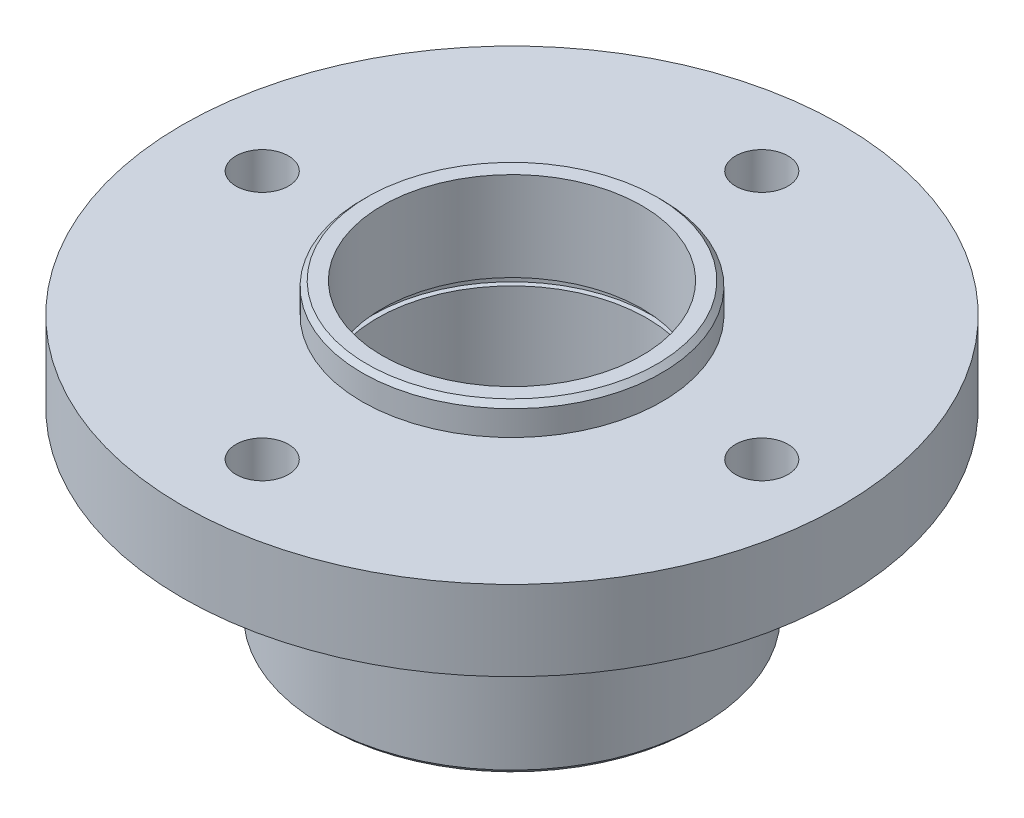
ISO-10303-21;
HEADER;
FILE_DESCRIPTION(('STEP AP214'),'2;1');
FILE_NAME('part.step','',(''),(''),'','','');
FILE_SCHEMA(('AUTOMOTIVE_DESIGN { 1 0 10303 214 1 1 1 1 }'));
ENDSEC;
DATA;
#1=APPLICATION_CONTEXT('core data for automotive mechanical design processes');
#2=APPLICATION_PROTOCOL_DEFINITION('international standard','automotive_design',2000,#1);
#3=PRODUCT_CONTEXT('',#1,'mechanical');
#4=PRODUCT('Part','Part','',(#3));
#5=PRODUCT_RELATED_PRODUCT_CATEGORY('part','',(#4));
#6=PRODUCT_DEFINITION_FORMATION('','',#4);
#7=PRODUCT_DEFINITION_CONTEXT('part definition',#1,'design');
#8=PRODUCT_DEFINITION('design','',#6,#7);
#9=PRODUCT_DEFINITION_SHAPE('','',#8);
#10=(LENGTH_UNIT() NAMED_UNIT(*) SI_UNIT(.MILLI.,.METRE.));
#11=(NAMED_UNIT(*) PLANE_ANGLE_UNIT() SI_UNIT($,.RADIAN.));
#12=(NAMED_UNIT(*) SI_UNIT($,.STERADIAN.) SOLID_ANGLE_UNIT());
#13=UNCERTAINTY_MEASURE_WITH_UNIT(LENGTH_MEASURE(1.E-05),#10,'distance_accuracy_value','');
#14=(GEOMETRIC_REPRESENTATION_CONTEXT(3) GLOBAL_UNCERTAINTY_ASSIGNED_CONTEXT((#13)) GLOBAL_UNIT_ASSIGNED_CONTEXT((#10,
#11,#12)) REPRESENTATION_CONTEXT('',''));
#15=CARTESIAN_POINT('',(0.,0.,0.));
#16=DIRECTION('',(0.,0.,1.));
#17=DIRECTION('',(1.,0.,0.));
#18=AXIS2_PLACEMENT_3D('',#15,#16,#17);
#19=CARTESIAN_POINT('',(26.,86.9231489378866,0.));
#20=DIRECTION('',(0.,1.,0.));
#21=DIRECTION('',(0.,0.,1.));
#22=AXIS2_PLACEMENT_3D('',#19,#20,#21);
#23=PLANE('',#22);
#24=CARTESIAN_POINT('',(0.,86.9231489378866,0.));
#25=DIRECTION('',(0.,-1.,0.));
#26=DIRECTION('',(0.,0.,-1.));
#27=AXIS2_PLACEMENT_3D('',#24,#25,#26);
#28=CIRCLE('',#27,26.);
#29=CARTESIAN_POINT('',(0.,86.9231489378866,-26.));
#30=VERTEX_POINT('',#29);
#31=EDGE_CURVE('E10',#30,#30,#28,.T.);
#32=ORIENTED_EDGE('',*,*,#31,.T.);
#33=EDGE_LOOP('',(#32));
#34=FACE_BOUND('',#33,.T.);
#35=CARTESIAN_POINT('',(0.,86.9231489378866,0.));
#36=DIRECTION('',(0.,-1.,0.));
#37=DIRECTION('',(0.,0.,-1.));
#38=AXIS2_PLACEMENT_3D('',#35,#36,#37);
#39=CIRCLE('',#38,29.);
#40=CARTESIAN_POINT('',(0.,86.9231489378866,-29.));
#41=VERTEX_POINT('',#40);
#42=EDGE_CURVE('E40',#41,#41,#39,.T.);
#43=ORIENTED_EDGE('',*,*,#42,.F.);
#44=EDGE_LOOP('',(#43));
#45=FACE_BOUND('',#44,.T.);
#46=ADVANCED_FACE('F34',(#34,#45),#23,.T.);
#47=CARTESIAN_POINT('',(0.,85.9231489378866,0.));
#48=DIRECTION('',(0.,-1.,0.));
#49=DIRECTION('',(0.,0.,-1.));
#50=AXIS2_PLACEMENT_3D('',#47,#48,#49);
#51=CONICAL_SURFACE('',#50,30.,0.785398163397448);
#52=ORIENTED_EDGE('',*,*,#42,.T.);
#53=EDGE_LOOP('',(#52));
#54=FACE_BOUND('',#53,.T.);
#55=CARTESIAN_POINT('',(0.,85.9231489378866,0.));
#56=DIRECTION('',(0.,-1.,0.));
#57=DIRECTION('',(0.,0.,-1.));
#58=AXIS2_PLACEMENT_3D('',#55,#56,#57);
#59=CIRCLE('',#58,30.);
#60=CARTESIAN_POINT('',(0.,85.9231489378866,-30.));
#61=VERTEX_POINT('',#60);
#62=EDGE_CURVE('E44',#61,#61,#59,.T.);
#63=ORIENTED_EDGE('',*,*,#62,.F.);
#64=EDGE_LOOP('',(#63));
#65=FACE_BOUND('',#64,.T.);
#66=ADVANCED_FACE('F211',(#54,#65),#51,.T.);
#67=CARTESIAN_POINT('',(0.,0.,0.));
#68=DIRECTION('',(0.,-1.,0.));
#69=DIRECTION('',(0.,0.,-1.));
#70=AXIS2_PLACEMENT_3D('',#67,#68,#69);
#71=CYLINDRICAL_SURFACE('',#70,30.);
#72=ORIENTED_EDGE('',*,*,#62,.T.);
#73=EDGE_LOOP('',(#72));
#74=FACE_BOUND('',#73,.T.);
#75=CARTESIAN_POINT('',(0.,80.9231489378866,0.));
#76=DIRECTION('',(0.,-1.,0.));
#77=DIRECTION('',(0.,0.,-1.));
#78=AXIS2_PLACEMENT_3D('',#75,#76,#77);
#79=CIRCLE('',#78,30.);
#80=CARTESIAN_POINT('',(0.,80.9231489378866,-30.));
#81=VERTEX_POINT('',#80);
#82=EDGE_CURVE('E48',#81,#81,#79,.T.);
#83=ORIENTED_EDGE('',*,*,#82,.F.);
#84=EDGE_LOOP('',(#83));
#85=FACE_BOUND('',#84,.T.);
#86=ADVANCED_FACE('F121',(#74,#85),#71,.T.);
#87=CARTESIAN_POINT('',(30.,80.9231489378866,0.));
#88=DIRECTION('',(0.,1.,0.));
#89=DIRECTION('',(0.,0.,1.));
#90=AXIS2_PLACEMENT_3D('',#87,#88,#89);
#91=PLANE('',#90);
#92=CARTESIAN_POINT('',(-50.,80.9231489378866,0.));
#93=DIRECTION('',(0.,1.,0.));
#94=DIRECTION('',(0.,0.,1.));
#95=AXIS2_PLACEMENT_3D('',#92,#93,#94);
#96=CIRCLE('',#95,5.25);
#97=CARTESIAN_POINT('',(-50.,80.9231489378866,5.25));
#98=VERTEX_POINT('',#97);
#99=EDGE_CURVE('E110',#98,#98,#96,.T.);
#100=ORIENTED_EDGE('',*,*,#99,.F.);
#101=EDGE_LOOP('',(#100));
#102=FACE_BOUND('',#101,.T.);
#103=CARTESIAN_POINT('',(1.74574066942157E-13,80.9231489378866,-50.));
#104=DIRECTION('',(0.,1.,0.));
#105=DIRECTION('',(0.,0.,1.));
#106=AXIS2_PLACEMENT_3D('',#103,#104,#105);
#107=CIRCLE('',#106,5.25);
#108=CARTESIAN_POINT('',(1.74574066942157E-13,80.9231489378866,-44.75));
#109=VERTEX_POINT('',#108);
#110=EDGE_CURVE('E104',#109,#109,#107,.T.);
#111=ORIENTED_EDGE('',*,*,#110,.F.);
#112=EDGE_LOOP('',(#111));
#113=FACE_BOUND('',#112,.T.);
#114=CARTESIAN_POINT('',(50.,80.9231489378866,3.49148133884313E-13));
#115=DIRECTION('',(0.,1.,0.));
#116=DIRECTION('',(0.,0.,1.));
#117=AXIS2_PLACEMENT_3D('',#114,#115,#116);
#118=CIRCLE('',#117,5.25);
#119=CARTESIAN_POINT('',(50.,80.9231489378866,5.25000000000035));
#120=VERTEX_POINT('',#119);
#121=EDGE_CURVE('E98',#120,#120,#118,.T.);
#122=ORIENTED_EDGE('',*,*,#121,.F.);
#123=EDGE_LOOP('',(#122));
#124=FACE_BOUND('',#123,.T.);
#125=CARTESIAN_POINT('',(-5.2372220082647E-13,80.9231489378866,50.));
#126=DIRECTION('',(0.,1.,0.));
#127=DIRECTION('',(0.,0.,1.));
#128=AXIS2_PLACEMENT_3D('',#125,#126,#127);
#129=CIRCLE('',#128,5.25);
#130=CARTESIAN_POINT('',(-5.2372220082647E-13,80.9231489378866,55.25));
#131=VERTEX_POINT('',#130);
#132=EDGE_CURVE('E92',#131,#131,#129,.T.);
#133=ORIENTED_EDGE('',*,*,#132,.F.);
#134=EDGE_LOOP('',(#133));
#135=FACE_BOUND('',#134,.T.);
#136=ORIENTED_EDGE('',*,*,#82,.T.);
#137=EDGE_LOOP('',(#136));
#138=FACE_BOUND('',#137,.T.);
#139=CARTESIAN_POINT('',(0.,80.9231489378866,0.));
#140=DIRECTION('',(0.,-1.,0.));
#141=DIRECTION('',(0.,0.,-1.));
#142=AXIS2_PLACEMENT_3D('',#139,#140,#141);
#143=CIRCLE('',#142,66.);
#144=CARTESIAN_POINT('',(0.,80.9231489378866,-66.));
#145=VERTEX_POINT('',#144);
#146=EDGE_CURVE('E53',#145,#145,#143,.T.);
#147=ORIENTED_EDGE('',*,*,#146,.F.);
#148=EDGE_LOOP('',(#147));
#149=FACE_BOUND('',#148,.T.);
#150=ADVANCED_FACE('F117',(#102,#113,#124,#135,#138,#149),#91,.T.);
#151=CARTESIAN_POINT('',(0.,0.,0.));
#152=DIRECTION('',(0.,-1.,0.));
#153=DIRECTION('',(0.,0.,-1.));
#154=AXIS2_PLACEMENT_3D('',#151,#152,#153);
#155=CYLINDRICAL_SURFACE('',#154,66.);
#156=ORIENTED_EDGE('',*,*,#146,.T.);
#157=EDGE_LOOP('',(#156));
#158=FACE_BOUND('',#157,.T.);
#159=CARTESIAN_POINT('',(0.,64.9231489378866,0.));
#160=DIRECTION('',(0.,-1.,0.));
#161=DIRECTION('',(0.,0.,-1.));
#162=AXIS2_PLACEMENT_3D('',#159,#160,#161);
#163=CIRCLE('',#162,66.);
#164=CARTESIAN_POINT('',(0.,64.9231489378866,-66.));
#165=VERTEX_POINT('',#164);
#166=EDGE_CURVE('E56',#165,#165,#163,.T.);
#167=ORIENTED_EDGE('',*,*,#166,.F.);
#168=EDGE_LOOP('',(#167));
#169=FACE_BOUND('',#168,.T.);
#170=ADVANCED_FACE('F120',(#158,#169),#155,.T.);
#171=CARTESIAN_POINT('',(66.,64.9231489378866,0.));
#172=DIRECTION('',(0.,-1.,0.));
#173=DIRECTION('',(0.,0.,-1.));
#174=AXIS2_PLACEMENT_3D('',#171,#172,#173);
#175=PLANE('',#174);
#176=CARTESIAN_POINT('',(-50.,64.9231489378866,0.));
#177=DIRECTION('',(0.,-1.,0.));
#178=DIRECTION('',(0.,0.,-1.));
#179=AXIS2_PLACEMENT_3D('',#176,#177,#178);
#180=CIRCLE('',#179,5.25);
#181=CARTESIAN_POINT('',(-50.,64.9231489378866,-5.25));
#182=VERTEX_POINT('',#181);
#183=EDGE_CURVE('E107',#182,#182,#180,.T.);
#184=ORIENTED_EDGE('',*,*,#183,.F.);
#185=EDGE_LOOP('',(#184));
#186=FACE_BOUND('',#185,.T.);
#187=CARTESIAN_POINT('',(1.74574066942157E-13,64.9231489378866,-50.));
#188=DIRECTION('',(0.,-1.,0.));
#189=DIRECTION('',(0.,0.,-1.));
#190=AXIS2_PLACEMENT_3D('',#187,#188,#189);
#191=CIRCLE('',#190,5.25);
#192=CARTESIAN_POINT('',(1.74574066942157E-13,64.9231489378866,-55.25));
#193=VERTEX_POINT('',#192);
#194=EDGE_CURVE('E101',#193,#193,#191,.T.);
#195=ORIENTED_EDGE('',*,*,#194,.F.);
#196=EDGE_LOOP('',(#195));
#197=FACE_BOUND('',#196,.T.);
#198=CARTESIAN_POINT('',(50.,64.9231489378866,3.49148133884313E-13));
#199=DIRECTION('',(0.,-1.,0.));
#200=DIRECTION('',(0.,0.,-1.));
#201=AXIS2_PLACEMENT_3D('',#198,#199,#200);
#202=CIRCLE('',#201,5.25);
#203=CARTESIAN_POINT('',(50.,64.9231489378866,-5.24999999999965));
#204=VERTEX_POINT('',#203);
#205=EDGE_CURVE('E95',#204,#204,#202,.T.);
#206=ORIENTED_EDGE('',*,*,#205,.F.);
#207=EDGE_LOOP('',(#206));
#208=FACE_BOUND('',#207,.T.);
#209=CARTESIAN_POINT('',(-5.2372220082647E-13,64.9231489378866,50.));
#210=DIRECTION('',(0.,-1.,0.));
#211=DIRECTION('',(0.,0.,-1.));
#212=AXIS2_PLACEMENT_3D('',#209,#210,#211);
#213=CIRCLE('',#212,5.25);
#214=CARTESIAN_POINT('',(-5.2372220082647E-13,64.9231489378866,44.75));
#215=VERTEX_POINT('',#214);
#216=EDGE_CURVE('E89',#215,#215,#213,.T.);
#217=ORIENTED_EDGE('',*,*,#216,.F.);
#218=EDGE_LOOP('',(#217));
#219=FACE_BOUND('',#218,.T.);
#220=ORIENTED_EDGE('',*,*,#166,.T.);
#221=EDGE_LOOP('',(#220));
#222=FACE_BOUND('',#221,.T.);
#223=CARTESIAN_POINT('',(0.,64.9231489378866,0.));
#224=DIRECTION('',(0.,-1.,0.));
#225=DIRECTION('',(0.,0.,-1.));
#226=AXIS2_PLACEMENT_3D('',#223,#224,#225);
#227=CIRCLE('',#226,38.);
#228=CARTESIAN_POINT('',(0.,64.9231489378866,-38.));
#229=VERTEX_POINT('',#228);
#230=EDGE_CURVE('E59',#229,#229,#227,.T.);
#231=ORIENTED_EDGE('',*,*,#230,.F.);
#232=EDGE_LOOP('',(#231));
#233=FACE_BOUND('',#232,.T.);
#234=ADVANCED_FACE('F135',(#186,#197,#208,#219,#222,#233),#175,.T.);
#235=CARTESIAN_POINT('',(0.,0.,0.));
#236=DIRECTION('',(0.,-1.,0.));
#237=DIRECTION('',(0.,0.,-1.));
#238=AXIS2_PLACEMENT_3D('',#235,#236,#237);
#239=CYLINDRICAL_SURFACE('',#238,38.);
#240=ORIENTED_EDGE('',*,*,#230,.T.);
#241=EDGE_LOOP('',(#240));
#242=FACE_BOUND('',#241,.T.);
#243=CARTESIAN_POINT('',(0.,28.9231489378866,0.));
#244=DIRECTION('',(0.,-1.,0.));
#245=DIRECTION('',(0.,0.,-1.));
#246=AXIS2_PLACEMENT_3D('',#243,#244,#245);
#247=CIRCLE('',#246,38.);
#248=CARTESIAN_POINT('',(0.,28.9231489378866,-38.));
#249=VERTEX_POINT('',#248);
#250=EDGE_CURVE('E62',#249,#249,#247,.T.);
#251=ORIENTED_EDGE('',*,*,#250,.F.);
#252=EDGE_LOOP('',(#251));
#253=FACE_BOUND('',#252,.T.);
#254=ADVANCED_FACE('F141',(#242,#253),#239,.T.);
#255=CARTESIAN_POINT('',(0.,27.9231489378866,0.));
#256=DIRECTION('',(0.,1.,0.));
#257=DIRECTION('',(0.,0.,1.));
#258=AXIS2_PLACEMENT_3D('',#255,#256,#257);
#259=CONICAL_SURFACE('',#258,37.,0.785398163397455);
#260=ORIENTED_EDGE('',*,*,#250,.T.);
#261=EDGE_LOOP('',(#260));
#262=FACE_BOUND('',#261,.T.);
#263=CARTESIAN_POINT('',(0.,27.9231489378866,0.));
#264=DIRECTION('',(0.,-1.,0.));
#265=DIRECTION('',(0.,0.,-1.));
#266=AXIS2_PLACEMENT_3D('',#263,#264,#265);
#267=CIRCLE('',#266,37.);
#268=CARTESIAN_POINT('',(0.,27.9231489378866,-37.));
#269=VERTEX_POINT('',#268);
#270=EDGE_CURVE('E65',#269,#269,#267,.T.);
#271=ORIENTED_EDGE('',*,*,#270,.F.);
#272=EDGE_LOOP('',(#271));
#273=FACE_BOUND('',#272,.T.);
#274=ADVANCED_FACE('F148',(#262,#273),#259,.T.);
#275=CARTESIAN_POINT('',(37.,27.9231489378866,0.));
#276=DIRECTION('',(0.,-1.,0.));
#277=DIRECTION('',(0.,0.,-1.));
#278=AXIS2_PLACEMENT_3D('',#275,#276,#277);
#279=PLANE('',#278);
#280=ORIENTED_EDGE('',*,*,#270,.T.);
#281=EDGE_LOOP('',(#280));
#282=FACE_BOUND('',#281,.T.);
#283=CARTESIAN_POINT('',(0.,27.9231489378866,0.));
#284=DIRECTION('',(0.,-1.,0.));
#285=DIRECTION('',(0.,0.,-1.));
#286=AXIS2_PLACEMENT_3D('',#283,#284,#285);
#287=CIRCLE('',#286,24.5);
#288=CARTESIAN_POINT('',(0.,27.9231489378866,-24.5));
#289=VERTEX_POINT('',#288);
#290=EDGE_CURVE('E68',#289,#289,#287,.T.);
#291=ORIENTED_EDGE('',*,*,#290,.F.);
#292=EDGE_LOOP('',(#291));
#293=FACE_BOUND('',#292,.T.);
#294=ADVANCED_FACE('F154',(#282,#293),#279,.T.);
#295=CARTESIAN_POINT('',(0.,0.,0.));
#296=DIRECTION('',(0.,-1.,0.));
#297=DIRECTION('',(0.,0.,-1.));
#298=AXIS2_PLACEMENT_3D('',#295,#296,#297);
#299=CYLINDRICAL_SURFACE('',#298,24.5);
#300=ORIENTED_EDGE('',*,*,#290,.T.);
#301=EDGE_LOOP('',(#300));
#302=FACE_BOUND('',#301,.T.);
#303=CARTESIAN_POINT('',(0.,29.9231489378866,0.));
#304=DIRECTION('',(0.,-1.,0.));
#305=DIRECTION('',(0.,0.,-1.));
#306=AXIS2_PLACEMENT_3D('',#303,#304,#305);
#307=CIRCLE('',#306,24.5);
#308=CARTESIAN_POINT('',(0.,29.9231489378866,-24.5));
#309=VERTEX_POINT('',#308);
#310=EDGE_CURVE('E71',#309,#309,#307,.T.);
#311=ORIENTED_EDGE('',*,*,#310,.F.);
#312=EDGE_LOOP('',(#311));
#313=FACE_BOUND('',#312,.T.);
#314=ADVANCED_FACE('F160',(#302,#313),#299,.F.);
#315=CARTESIAN_POINT('',(24.5,29.9231489378866,0.));
#316=DIRECTION('',(0.,1.,0.));
#317=DIRECTION('',(0.,0.,1.));
#318=AXIS2_PLACEMENT_3D('',#315,#316,#317);
#319=PLANE('',#318);
#320=ORIENTED_EDGE('',*,*,#310,.T.);
#321=EDGE_LOOP('',(#320));
#322=FACE_BOUND('',#321,.T.);
#323=CARTESIAN_POINT('',(0.,29.9231489378866,0.));
#324=DIRECTION('',(0.,-1.,0.));
#325=DIRECTION('',(0.,0.,-1.));
#326=AXIS2_PLACEMENT_3D('',#323,#324,#325);
#327=CIRCLE('',#326,27.);
#328=CARTESIAN_POINT('',(0.,29.9231489378866,-27.));
#329=VERTEX_POINT('',#328);
#330=EDGE_CURVE('E74',#329,#329,#327,.T.);
#331=ORIENTED_EDGE('',*,*,#330,.F.);
#332=EDGE_LOOP('',(#331));
#333=FACE_BOUND('',#332,.T.);
#334=ADVANCED_FACE('F166',(#322,#333),#319,.T.);
#335=CARTESIAN_POINT('',(0.,0.,0.));
#336=DIRECTION('',(0.,-1.,0.));
#337=DIRECTION('',(0.,0.,-1.));
#338=AXIS2_PLACEMENT_3D('',#335,#336,#337);
#339=CYLINDRICAL_SURFACE('',#338,27.);
#340=ORIENTED_EDGE('',*,*,#330,.T.);
#341=EDGE_LOOP('',(#340));
#342=FACE_BOUND('',#341,.T.);
#343=CARTESIAN_POINT('',(0.,66.9231489378866,0.));
#344=DIRECTION('',(0.,-1.,0.));
#345=DIRECTION('',(0.,0.,-1.));
#346=AXIS2_PLACEMENT_3D('',#343,#344,#345);
#347=CIRCLE('',#346,27.);
#348=CARTESIAN_POINT('',(0.,66.9231489378866,-27.));
#349=VERTEX_POINT('',#348);
#350=EDGE_CURVE('E77',#349,#349,#347,.T.);
#351=ORIENTED_EDGE('',*,*,#350,.F.);
#352=EDGE_LOOP('',(#351));
#353=FACE_BOUND('',#352,.T.);
#354=ADVANCED_FACE('F172',(#342,#353),#339,.F.);
#355=CARTESIAN_POINT('',(27.,66.9231489378866,0.));
#356=DIRECTION('',(0.,1.,0.));
#357=DIRECTION('',(0.,0.,1.));
#358=AXIS2_PLACEMENT_3D('',#355,#356,#357);
#359=PLANE('',#358);
#360=ORIENTED_EDGE('',*,*,#350,.T.);
#361=EDGE_LOOP('',(#360));
#362=FACE_BOUND('',#361,.T.);
#363=CARTESIAN_POINT('',(0.,66.9231489378866,0.));
#364=DIRECTION('',(0.,-1.,0.));
#365=DIRECTION('',(0.,0.,-1.));
#366=AXIS2_PLACEMENT_3D('',#363,#364,#365);
#367=CIRCLE('',#366,28.);
#368=CARTESIAN_POINT('',(0.,66.9231489378866,-28.));
#369=VERTEX_POINT('',#368);
#370=EDGE_CURVE('E80',#369,#369,#367,.T.);
#371=ORIENTED_EDGE('',*,*,#370,.F.);
#372=EDGE_LOOP('',(#371));
#373=FACE_BOUND('',#372,.T.);
#374=ADVANCED_FACE('F178',(#362,#373),#359,.T.);
#375=CARTESIAN_POINT('',(0.,0.,0.));
#376=DIRECTION('',(0.,-1.,0.));
#377=DIRECTION('',(0.,0.,-1.));
#378=AXIS2_PLACEMENT_3D('',#375,#376,#377);
#379=CYLINDRICAL_SURFACE('',#378,28.);
#380=ORIENTED_EDGE('',*,*,#370,.T.);
#381=EDGE_LOOP('',(#380));
#382=FACE_BOUND('',#381,.T.);
#383=CARTESIAN_POINT('',(0.,69.0731489378866,0.));
#384=DIRECTION('',(0.,-1.,0.));
#385=DIRECTION('',(0.,0.,-1.));
#386=AXIS2_PLACEMENT_3D('',#383,#384,#385);
#387=CIRCLE('',#386,28.);
#388=CARTESIAN_POINT('',(0.,69.0731489378866,-28.));
#389=VERTEX_POINT('',#388);
#390=EDGE_CURVE('E83',#389,#389,#387,.T.);
#391=ORIENTED_EDGE('',*,*,#390,.F.);
#392=EDGE_LOOP('',(#391));
#393=FACE_BOUND('',#392,.T.);
#394=ADVANCED_FACE('F184',(#382,#393),#379,.F.);
#395=CARTESIAN_POINT('',(28.,69.0731489378866,0.));
#396=DIRECTION('',(0.,-1.,0.));
#397=DIRECTION('',(0.,0.,-1.));
#398=AXIS2_PLACEMENT_3D('',#395,#396,#397);
#399=PLANE('',#398);
#400=ORIENTED_EDGE('',*,*,#390,.T.);
#401=EDGE_LOOP('',(#400));
#402=FACE_BOUND('',#401,.T.);
#403=CARTESIAN_POINT('',(0.,69.0731489378866,0.));
#404=DIRECTION('',(0.,-1.,0.));
#405=DIRECTION('',(0.,0.,-1.));
#406=AXIS2_PLACEMENT_3D('',#403,#404,#405);
#407=CIRCLE('',#406,26.);
#408=CARTESIAN_POINT('',(0.,69.0731489378866,-26.));
#409=VERTEX_POINT('',#408);
#410=EDGE_CURVE('E86',#409,#409,#407,.T.);
#411=ORIENTED_EDGE('',*,*,#410,.F.);
#412=EDGE_LOOP('',(#411));
#413=FACE_BOUND('',#412,.T.);
#414=ADVANCED_FACE('F190',(#402,#413),#399,.T.);
#415=CARTESIAN_POINT('',(0.,0.,0.));
#416=DIRECTION('',(0.,-1.,0.));
#417=DIRECTION('',(0.,0.,-1.));
#418=AXIS2_PLACEMENT_3D('',#415,#416,#417);
#419=CYLINDRICAL_SURFACE('',#418,26.);
#420=ORIENTED_EDGE('',*,*,#410,.T.);
#421=EDGE_LOOP('',(#420));
#422=FACE_BOUND('',#421,.T.);
#423=ORIENTED_EDGE('',*,*,#31,.F.);
#424=EDGE_LOOP('',(#423));
#425=FACE_BOUND('',#424,.T.);
#426=ADVANCED_FACE('F196',(#422,#425),#419,.F.);
#427=CARTESIAN_POINT('',(-5.2372220082647E-13,80.9231489378866,50.));
#428=DIRECTION('',(0.,1.,0.));
#429=DIRECTION('',(0.,0.,1.));
#430=AXIS2_PLACEMENT_3D('',#427,#428,#429);
#431=CYLINDRICAL_SURFACE('',#430,5.25);
#432=ORIENTED_EDGE('',*,*,#132,.T.);
#433=EDGE_LOOP('',(#432));
#434=FACE_BOUND('',#433,.T.);
#435=ORIENTED_EDGE('',*,*,#216,.T.);
#436=EDGE_LOOP('',(#435));
#437=FACE_BOUND('',#436,.T.);
#438=ADVANCED_FACE('F202',(#434,#437),#431,.F.);
#439=CARTESIAN_POINT('',(50.,80.9231489378866,3.49148133884313E-13));
#440=DIRECTION('',(0.,1.,0.));
#441=DIRECTION('',(0.,0.,1.));
#442=AXIS2_PLACEMENT_3D('',#439,#440,#441);
#443=CYLINDRICAL_SURFACE('',#442,5.25);
#444=ORIENTED_EDGE('',*,*,#121,.T.);
#445=EDGE_LOOP('',(#444));
#446=FACE_BOUND('',#445,.T.);
#447=ORIENTED_EDGE('',*,*,#205,.T.);
#448=EDGE_LOOP('',(#447));
#449=FACE_BOUND('',#448,.T.);
#450=ADVANCED_FACE('F207',(#446,#449),#443,.F.);
#451=CARTESIAN_POINT('',(1.74574066942157E-13,80.9231489378866,-50.));
#452=DIRECTION('',(0.,1.,0.));
#453=DIRECTION('',(0.,0.,1.));
#454=AXIS2_PLACEMENT_3D('',#451,#452,#453);
#455=CYLINDRICAL_SURFACE('',#454,5.25);
#456=ORIENTED_EDGE('',*,*,#110,.T.);
#457=EDGE_LOOP('',(#456));
#458=FACE_BOUND('',#457,.T.);
#459=ORIENTED_EDGE('',*,*,#194,.T.);
#460=EDGE_LOOP('',(#459));
#461=FACE_BOUND('',#460,.T.);
#462=ADVANCED_FACE('F297',(#458,#461),#455,.F.);
#463=CARTESIAN_POINT('',(-50.,80.9231489378866,0.));
#464=DIRECTION('',(0.,1.,0.));
#465=DIRECTION('',(0.,0.,1.));
#466=AXIS2_PLACEMENT_3D('',#463,#464,#465);
#467=CYLINDRICAL_SURFACE('',#466,5.25);
#468=ORIENTED_EDGE('',*,*,#99,.T.);
#469=EDGE_LOOP('',(#468));
#470=FACE_BOUND('',#469,.T.);
#471=ORIENTED_EDGE('',*,*,#183,.T.);
#472=EDGE_LOOP('',(#471));
#473=FACE_BOUND('',#472,.T.);
#474=ADVANCED_FACE('F114',(#470,#473),#467,.F.);
#475=CLOSED_SHELL('',(#46,#66,#86,#150,#170,#234,#254,#274,#294,#314,#334,#354,#374,#394,#414,
#426,#438,#450,#462,#474));
#476=MANIFOLD_SOLID_BREP('B2',#475);
#477=ADVANCED_BREP_SHAPE_REPRESENTATION('',(#18,#476),#14);
#478=SHAPE_DEFINITION_REPRESENTATION(#9,#477);
ENDSEC;
END-ISO-10303-21;
